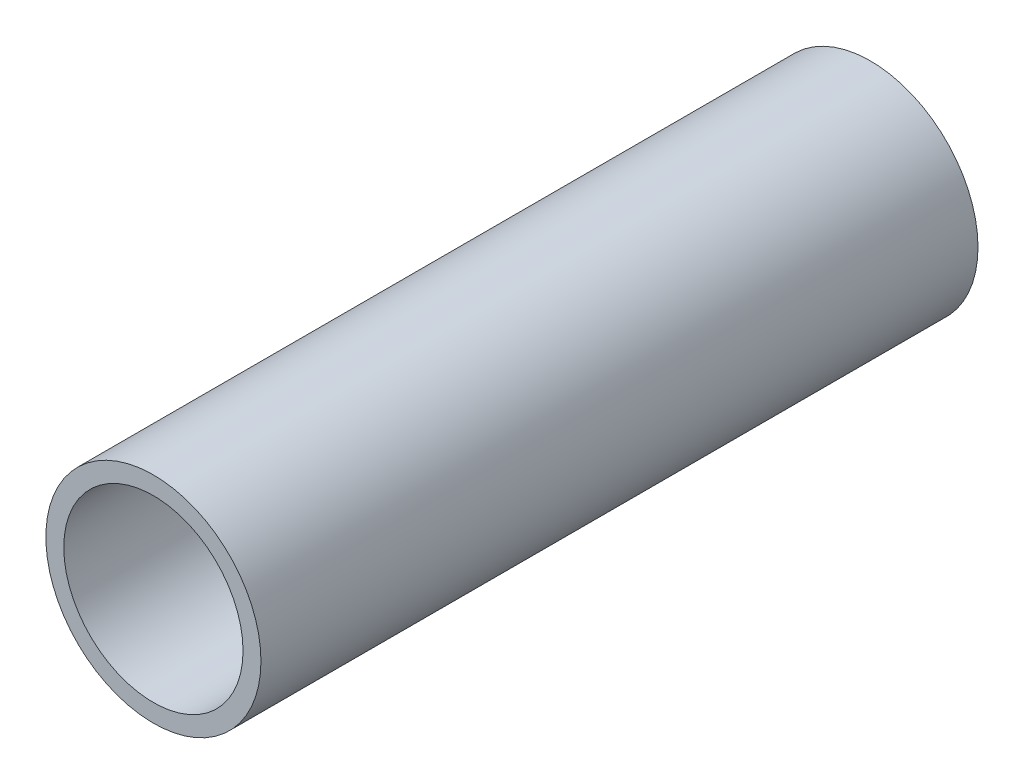
ISO-10303-21;
HEADER;
FILE_DESCRIPTION(('STEP AP214'),'2;1');
FILE_NAME('part.step','',(''),(''),'','','');
FILE_SCHEMA(('AUTOMOTIVE_DESIGN { 1 0 10303 214 1 1 1 1 }'));
ENDSEC;
DATA;
#1=APPLICATION_CONTEXT('core data for automotive mechanical design processes');
#2=APPLICATION_PROTOCOL_DEFINITION('international standard','automotive_design',2000,#1);
#3=PRODUCT_CONTEXT('',#1,'mechanical');
#4=PRODUCT('Part','Part','',(#3));
#5=PRODUCT_RELATED_PRODUCT_CATEGORY('part','',(#4));
#6=PRODUCT_DEFINITION_FORMATION('','',#4);
#7=PRODUCT_DEFINITION_CONTEXT('part definition',#1,'design');
#8=PRODUCT_DEFINITION('design','',#6,#7);
#9=PRODUCT_DEFINITION_SHAPE('','',#8);
#10=(LENGTH_UNIT() NAMED_UNIT(*) SI_UNIT(.MILLI.,.METRE.));
#11=(NAMED_UNIT(*) PLANE_ANGLE_UNIT() SI_UNIT($,.RADIAN.));
#12=(NAMED_UNIT(*) SI_UNIT($,.STERADIAN.) SOLID_ANGLE_UNIT());
#13=UNCERTAINTY_MEASURE_WITH_UNIT(LENGTH_MEASURE(1.E-05),#10,'distance_accuracy_value','');
#14=(GEOMETRIC_REPRESENTATION_CONTEXT(3) GLOBAL_UNCERTAINTY_ASSIGNED_CONTEXT((#13)) GLOBAL_UNIT_ASSIGNED_CONTEXT((#10,
#11,#12)) REPRESENTATION_CONTEXT('',''));
#15=CARTESIAN_POINT('',(0.,0.,0.));
#16=DIRECTION('',(0.,0.,1.));
#17=DIRECTION('',(1.,0.,0.));
#18=AXIS2_PLACEMENT_3D('',#15,#16,#17);
#19=CARTESIAN_POINT('',(0.,0.,0.));
#20=DIRECTION('',(0.,0.,1.));
#21=DIRECTION('',(1.,0.,0.));
#22=AXIS2_PLACEMENT_3D('',#19,#20,#21);
#23=PLANE('',#22);
#24=CARTESIAN_POINT('',(0.,0.,0.));
#25=DIRECTION('',(0.,0.,1.));
#26=DIRECTION('',(1.,0.,0.));
#27=AXIS2_PLACEMENT_3D('',#24,#25,#26);
#28=CIRCLE('',#27,5.);
#29=CARTESIAN_POINT('',(5.,0.,0.));
#30=VERTEX_POINT('',#29);
#31=EDGE_CURVE('E54',#30,#30,#28,.T.);
#32=ORIENTED_EDGE('',*,*,#31,.T.);
#33=EDGE_LOOP('',(#32));
#34=FACE_BOUND('',#33,.T.);
#35=CARTESIAN_POINT('',(0.,0.,0.));
#36=DIRECTION('',(0.,0.,1.));
#37=DIRECTION('',(1.,0.,0.));
#38=AXIS2_PLACEMENT_3D('',#35,#36,#37);
#39=CIRCLE('',#38,6.);
#40=CARTESIAN_POINT('',(6.,0.,0.));
#41=VERTEX_POINT('',#40);
#42=EDGE_CURVE('E42',#41,#41,#39,.T.);
#43=ORIENTED_EDGE('',*,*,#42,.F.);
#44=EDGE_LOOP('',(#43));
#45=FACE_BOUND('',#44,.T.);
#46=ADVANCED_FACE('F37',(#34,#45),#23,.F.);
#47=CARTESIAN_POINT('',(0.,0.,40.));
#48=DIRECTION('',(0.,0.,1.));
#49=DIRECTION('',(1.,0.,0.));
#50=AXIS2_PLACEMENT_3D('',#47,#48,#49);
#51=PLANE('',#50);
#52=CARTESIAN_POINT('',(0.,0.,40.));
#53=DIRECTION('',(0.,0.,1.));
#54=DIRECTION('',(1.,0.,0.));
#55=AXIS2_PLACEMENT_3D('',#52,#53,#54);
#56=CIRCLE('',#55,5.);
#57=CARTESIAN_POINT('',(5.,0.,40.));
#58=VERTEX_POINT('',#57);
#59=EDGE_CURVE('E51',#58,#58,#56,.T.);
#60=ORIENTED_EDGE('',*,*,#59,.F.);
#61=EDGE_LOOP('',(#60));
#62=FACE_BOUND('',#61,.T.);
#63=CARTESIAN_POINT('',(0.,0.,40.));
#64=DIRECTION('',(0.,0.,1.));
#65=DIRECTION('',(1.,0.,0.));
#66=AXIS2_PLACEMENT_3D('',#63,#64,#65);
#67=CIRCLE('',#66,6.);
#68=CARTESIAN_POINT('',(6.,0.,40.));
#69=VERTEX_POINT('',#68);
#70=EDGE_CURVE('E10',#69,#69,#67,.T.);
#71=ORIENTED_EDGE('',*,*,#70,.T.);
#72=EDGE_LOOP('',(#71));
#73=FACE_BOUND('',#72,.T.);
#74=ADVANCED_FACE('F68',(#62,#73),#51,.T.);
#75=CARTESIAN_POINT('',(0.,0.,0.));
#76=DIRECTION('',(0.,0.,1.));
#77=DIRECTION('',(1.,0.,0.));
#78=AXIS2_PLACEMENT_3D('',#75,#76,#77);
#79=CYLINDRICAL_SURFACE('',#78,6.);
#80=ORIENTED_EDGE('',*,*,#70,.F.);
#81=EDGE_LOOP('',(#80));
#82=FACE_BOUND('',#81,.T.);
#83=ORIENTED_EDGE('',*,*,#42,.T.);
#84=EDGE_LOOP('',(#83));
#85=FACE_BOUND('',#84,.T.);
#86=ADVANCED_FACE('F45',(#82,#85),#79,.T.);
#87=CARTESIAN_POINT('',(0.,0.,0.));
#88=DIRECTION('',(0.,0.,1.));
#89=DIRECTION('',(1.,0.,0.));
#90=AXIS2_PLACEMENT_3D('',#87,#88,#89);
#91=CYLINDRICAL_SURFACE('',#90,5.);
#92=ORIENTED_EDGE('',*,*,#59,.T.);
#93=EDGE_LOOP('',(#92));
#94=FACE_BOUND('',#93,.T.);
#95=ORIENTED_EDGE('',*,*,#31,.F.);
#96=EDGE_LOOP('',(#95));
#97=FACE_BOUND('',#96,.T.);
#98=ADVANCED_FACE('F63',(#94,#97),#91,.F.);
#99=CLOSED_SHELL('',(#46,#74,#86,#98));
#100=MANIFOLD_SOLID_BREP('B2',#99);
#101=ADVANCED_BREP_SHAPE_REPRESENTATION('',(#18,#100),#14);
#102=SHAPE_DEFINITION_REPRESENTATION(#9,#101);
ENDSEC;
END-ISO-10303-21;
